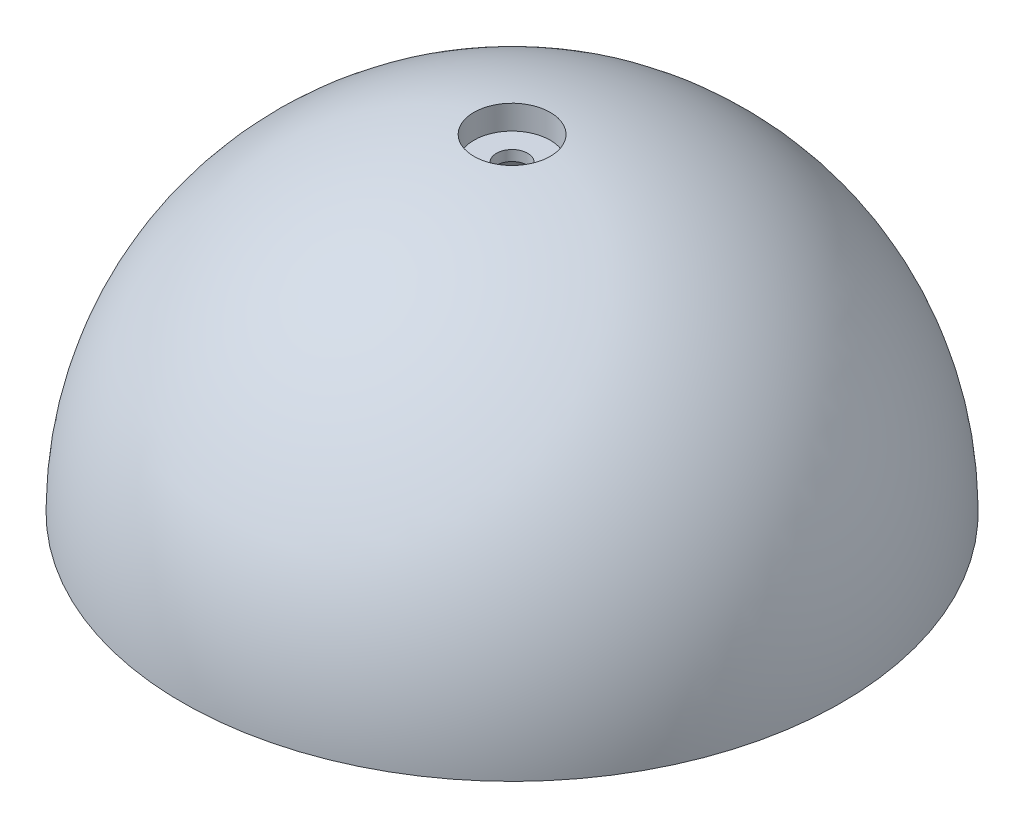
ISO-10303-21;
HEADER;
FILE_DESCRIPTION(('STEP AP214'),'2;1');
FILE_NAME('part.step','',(''),(''),'','','');
FILE_SCHEMA(('AUTOMOTIVE_DESIGN { 1 0 10303 214 1 1 1 1 }'));
ENDSEC;
DATA;
#1=APPLICATION_CONTEXT('core data for automotive mechanical design processes');
#2=APPLICATION_PROTOCOL_DEFINITION('international standard','automotive_design',2000,#1);
#3=PRODUCT_CONTEXT('',#1,'mechanical');
#4=PRODUCT('Part','Part','',(#3));
#5=PRODUCT_RELATED_PRODUCT_CATEGORY('part','',(#4));
#6=PRODUCT_DEFINITION_FORMATION('','',#4);
#7=PRODUCT_DEFINITION_CONTEXT('part definition',#1,'design');
#8=PRODUCT_DEFINITION('design','',#6,#7);
#9=PRODUCT_DEFINITION_SHAPE('','',#8);
#10=(LENGTH_UNIT() NAMED_UNIT(*) SI_UNIT(.MILLI.,.METRE.));
#11=(NAMED_UNIT(*) PLANE_ANGLE_UNIT() SI_UNIT($,.RADIAN.));
#12=(NAMED_UNIT(*) SI_UNIT($,.STERADIAN.) SOLID_ANGLE_UNIT());
#13=UNCERTAINTY_MEASURE_WITH_UNIT(LENGTH_MEASURE(1.E-05),#10,'distance_accuracy_value','');
#14=(GEOMETRIC_REPRESENTATION_CONTEXT(3) GLOBAL_UNCERTAINTY_ASSIGNED_CONTEXT((#13)) GLOBAL_UNIT_ASSIGNED_CONTEXT((#10,
#11,#12)) REPRESENTATION_CONTEXT('',''));
#15=CARTESIAN_POINT('',(0.,0.,0.));
#16=DIRECTION('',(0.,0.,1.));
#17=DIRECTION('',(1.,0.,0.));
#18=AXIS2_PLACEMENT_3D('',#15,#16,#17);
#19=CARTESIAN_POINT('',(0.,95.,0.));
#20=DIRECTION('',(0.,-1.,0.));
#21=DIRECTION('',(0.,0.,-1.));
#22=AXIS2_PLACEMENT_3D('',#19,#20,#21);
#23=CYLINDRICAL_SURFACE('',#22,11.);
#24=CARTESIAN_POINT('',(0.,84.2852300228219,0.));
#25=DIRECTION('',(0.,-1.,0.));
#26=DIRECTION('',(0.,0.,-1.));
#27=AXIS2_PLACEMENT_3D('',#24,#25,#26);
#28=CIRCLE('',#27,11.);
#29=CARTESIAN_POINT('',(0.,84.2852300228219,-11.));
#30=VERTEX_POINT('',#29);
#31=EDGE_CURVE('E54',#30,#30,#28,.T.);
#32=ORIENTED_EDGE('',*,*,#31,.T.);
#33=EDGE_LOOP('',(#32));
#34=FACE_BOUND('',#33,.T.);
#35=CARTESIAN_POINT('',(0.,84.4,0.));
#36=DIRECTION('',(0.,1.,0.));
#37=DIRECTION('',(0.,0.,1.));
#38=AXIS2_PLACEMENT_3D('',#35,#36,#37);
#39=CIRCLE('',#38,11.);
#40=CARTESIAN_POINT('',(0.,84.4,11.));
#41=VERTEX_POINT('',#40);
#42=EDGE_CURVE('E62',#41,#41,#39,.T.);
#43=ORIENTED_EDGE('',*,*,#42,.T.);
#44=EDGE_LOOP('',(#43));
#45=FACE_BOUND('',#44,.T.);
#46=ADVANCED_FACE('F39',(#34,#45),#23,.F.);
#47=CARTESIAN_POINT('',(0.,0.,0.));
#48=DIRECTION('',(0.,-1.,0.));
#49=DIRECTION('',(-1.,0.,0.));
#50=AXIS2_PLACEMENT_3D('',#47,#48,#49);
#51=SPHERICAL_SURFACE('',#50,85.);
#52=CARTESIAN_POINT('',(0.,0.,0.));
#53=DIRECTION('',(0.,-1.,0.));
#54=DIRECTION('',(0.,0.,-1.));
#55=AXIS2_PLACEMENT_3D('',#52,#53,#54);
#56=CIRCLE('',#55,85.);
#57=CARTESIAN_POINT('',(0.,0.,-85.));
#58=VERTEX_POINT('',#57);
#59=EDGE_CURVE('E48',#58,#58,#56,.F.);
#60=ORIENTED_EDGE('',*,*,#59,.F.);
#61=EDGE_LOOP('',(#60));
#62=FACE_BOUND('',#61,.T.);
#63=ORIENTED_EDGE('',*,*,#31,.F.);
#64=EDGE_LOOP('',(#63));
#65=FACE_BOUND('',#64,.T.);
#66=ADVANCED_FACE('F96',(#62,#65),#51,.F.);
#67=CARTESIAN_POINT('',(0.,0.,0.));
#68=DIRECTION('',(0.,-1.,0.));
#69=DIRECTION('',(-1.,0.,0.));
#70=AXIS2_PLACEMENT_3D('',#67,#68,#69);
#71=SPHERICAL_SURFACE('',#70,95.);
#72=CARTESIAN_POINT('',(0.,0.,0.));
#73=DIRECTION('',(0.,-1.,0.));
#74=DIRECTION('',(0.,0.,-1.));
#75=AXIS2_PLACEMENT_3D('',#72,#73,#74);
#76=CIRCLE('',#75,95.);
#77=CARTESIAN_POINT('',(0.,0.,-95.));
#78=VERTEX_POINT('',#77);
#79=EDGE_CURVE('E10',#78,#78,#76,.T.);
#80=ORIENTED_EDGE('',*,*,#79,.F.);
#81=EDGE_LOOP('',(#80));
#82=FACE_BOUND('',#81,.T.);
#83=CARTESIAN_POINT('',(0.,94.3610088966836,0.));
#84=DIRECTION('',(0.,-1.,0.));
#85=DIRECTION('',(0.,0.,-1.));
#86=AXIS2_PLACEMENT_3D('',#83,#84,#85);
#87=CIRCLE('',#86,11.);
#88=CARTESIAN_POINT('',(0.,94.3610088966836,-11.));
#89=VERTEX_POINT('',#88);
#90=EDGE_CURVE('E59',#89,#89,#87,.F.);
#91=ORIENTED_EDGE('',*,*,#90,.F.);
#92=EDGE_LOOP('',(#91));
#93=FACE_BOUND('',#92,.T.);
#94=ADVANCED_FACE('F41',(#82,#93),#71,.T.);
#95=CARTESIAN_POINT('',(0.,0.,0.));
#96=DIRECTION('',(0.,-1.,0.));
#97=DIRECTION('',(0.,0.,-1.));
#98=AXIS2_PLACEMENT_3D('',#95,#96,#97);
#99=PLANE('',#98);
#100=ORIENTED_EDGE('',*,*,#59,.T.);
#101=EDGE_LOOP('',(#100));
#102=FACE_BOUND('',#101,.T.);
#103=ORIENTED_EDGE('',*,*,#79,.T.);
#104=EDGE_LOOP('',(#103));
#105=FACE_BOUND('',#104,.T.);
#106=ADVANCED_FACE('F106',(#102,#105),#99,.T.);
#107=ORIENTED_EDGE('',*,*,#90,.T.);
#108=EDGE_LOOP('',(#107));
#109=FACE_BOUND('',#108,.T.);
#110=CARTESIAN_POINT('',(0.,87.4,0.));
#111=DIRECTION('',(0.,1.,0.));
#112=DIRECTION('',(0.,0.,1.));
#113=AXIS2_PLACEMENT_3D('',#110,#111,#112);
#114=CIRCLE('',#113,11.);
#115=CARTESIAN_POINT('',(0.,87.4,11.));
#116=VERTEX_POINT('',#115);
#117=EDGE_CURVE('E65',#116,#116,#114,.T.);
#118=ORIENTED_EDGE('',*,*,#117,.F.);
#119=EDGE_LOOP('',(#118));
#120=FACE_BOUND('',#119,.T.);
#121=ADVANCED_FACE('F92',(#109,#120),#23,.F.);
#122=CARTESIAN_POINT('',(0.,84.4,0.));
#123=DIRECTION('',(0.,1.,0.));
#124=DIRECTION('',(0.,0.,1.));
#125=AXIS2_PLACEMENT_3D('',#122,#123,#124);
#126=PLANE('',#125);
#127=CARTESIAN_POINT('',(0.,84.4,0.));
#128=DIRECTION('',(0.,1.,0.));
#129=DIRECTION('',(0.,0.,1.));
#130=AXIS2_PLACEMENT_3D('',#127,#128,#129);
#131=CIRCLE('',#130,4.5);
#132=CARTESIAN_POINT('',(0.,84.4,4.5));
#133=VERTEX_POINT('',#132);
#134=EDGE_CURVE('E43',#133,#133,#131,.T.);
#135=ORIENTED_EDGE('',*,*,#134,.T.);
#136=EDGE_LOOP('',(#135));
#137=FACE_BOUND('',#136,.T.);
#138=ORIENTED_EDGE('',*,*,#42,.F.);
#139=EDGE_LOOP('',(#138));
#140=FACE_BOUND('',#139,.T.);
#141=ADVANCED_FACE('F85',(#137,#140),#126,.F.);
#142=CARTESIAN_POINT('',(0.,87.4,0.));
#143=DIRECTION('',(0.,1.,0.));
#144=DIRECTION('',(0.,0.,1.));
#145=AXIS2_PLACEMENT_3D('',#142,#143,#144);
#146=PLANE('',#145);
#147=CARTESIAN_POINT('',(0.,87.4,0.));
#148=DIRECTION('',(0.,1.,0.));
#149=DIRECTION('',(0.,0.,1.));
#150=AXIS2_PLACEMENT_3D('',#147,#148,#149);
#151=CIRCLE('',#150,4.5);
#152=CARTESIAN_POINT('',(0.,87.4,4.5));
#153=VERTEX_POINT('',#152);
#154=EDGE_CURVE('E74',#153,#153,#151,.T.);
#155=ORIENTED_EDGE('',*,*,#154,.F.);
#156=EDGE_LOOP('',(#155));
#157=FACE_BOUND('',#156,.T.);
#158=ORIENTED_EDGE('',*,*,#117,.T.);
#159=EDGE_LOOP('',(#158));
#160=FACE_BOUND('',#159,.T.);
#161=ADVANCED_FACE('F83',(#157,#160),#146,.T.);
#162=CARTESIAN_POINT('',(0.,0.,0.));
#163=DIRECTION('',(0.,1.,0.));
#164=DIRECTION('',(0.,0.,1.));
#165=AXIS2_PLACEMENT_3D('',#162,#163,#164);
#166=CYLINDRICAL_SURFACE('',#165,4.5);
#167=ORIENTED_EDGE('',*,*,#154,.T.);
#168=EDGE_LOOP('',(#167));
#169=FACE_BOUND('',#168,.T.);
#170=ORIENTED_EDGE('',*,*,#134,.F.);
#171=EDGE_LOOP('',(#170));
#172=FACE_BOUND('',#171,.T.);
#173=ADVANCED_FACE('F80',(#169,#172),#166,.F.);
#174=CLOSED_SHELL('',(#46,#66,#94,#106,#121,#141,#161,#173));
#175=MANIFOLD_SOLID_BREP('B2',#174);
#176=ADVANCED_BREP_SHAPE_REPRESENTATION('',(#18,#175),#14);
#177=SHAPE_DEFINITION_REPRESENTATION(#9,#176);
ENDSEC;
END-ISO-10303-21;
